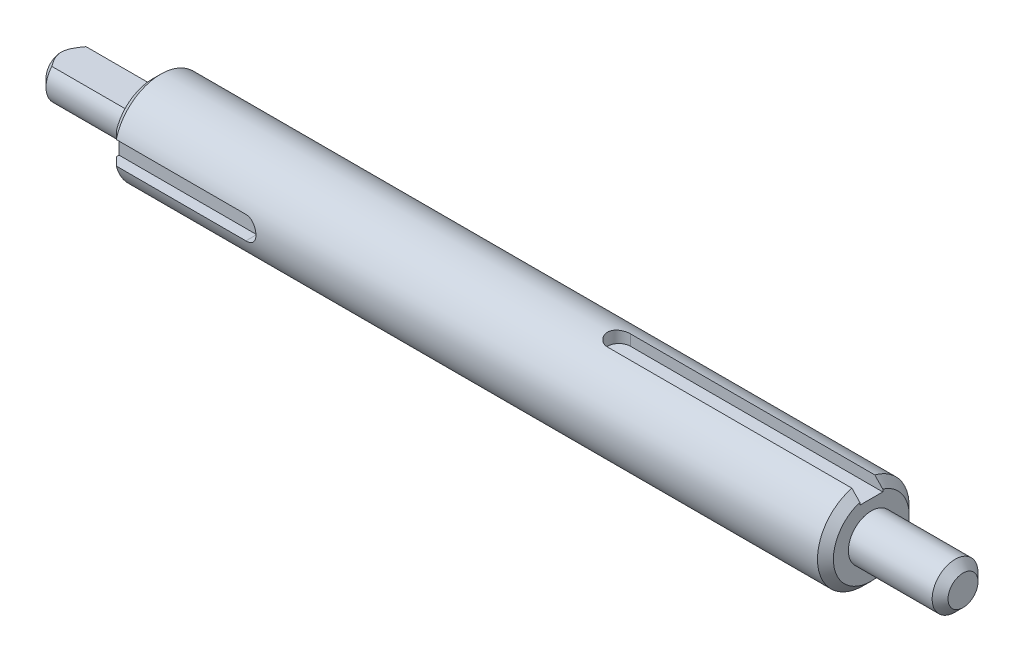
ISO-10303-21;
HEADER;
FILE_DESCRIPTION(('STEP AP214'),'2;1');
FILE_NAME('part.step','',(''),(''),'','','');
FILE_SCHEMA(('AUTOMOTIVE_DESIGN { 1 0 10303 214 1 1 1 1 }'));
ENDSEC;
DATA;
#1=APPLICATION_CONTEXT('core data for automotive mechanical design processes');
#2=APPLICATION_PROTOCOL_DEFINITION('international standard','automotive_design',2000,#1);
#3=PRODUCT_CONTEXT('',#1,'mechanical');
#4=PRODUCT('Part','Part','',(#3));
#5=PRODUCT_RELATED_PRODUCT_CATEGORY('part','',(#4));
#6=PRODUCT_DEFINITION_FORMATION('','',#4);
#7=PRODUCT_DEFINITION_CONTEXT('part definition',#1,'design');
#8=PRODUCT_DEFINITION('design','',#6,#7);
#9=PRODUCT_DEFINITION_SHAPE('','',#8);
#10=(LENGTH_UNIT() NAMED_UNIT(*) SI_UNIT(.MILLI.,.METRE.));
#11=(NAMED_UNIT(*) PLANE_ANGLE_UNIT() SI_UNIT($,.RADIAN.));
#12=(NAMED_UNIT(*) SI_UNIT($,.STERADIAN.) SOLID_ANGLE_UNIT());
#13=UNCERTAINTY_MEASURE_WITH_UNIT(LENGTH_MEASURE(1.E-05),#10,'distance_accuracy_value','');
#14=(GEOMETRIC_REPRESENTATION_CONTEXT(3) GLOBAL_UNCERTAINTY_ASSIGNED_CONTEXT((#13)) GLOBAL_UNIT_ASSIGNED_CONTEXT((#10,
#11,#12)) REPRESENTATION_CONTEXT('',''));
#15=CARTESIAN_POINT('',(0.,0.,0.));
#16=DIRECTION('',(0.,0.,1.));
#17=DIRECTION('',(1.,0.,0.));
#18=AXIS2_PLACEMENT_3D('',#15,#16,#17);
#19=CARTESIAN_POINT('',(0.,0.,0.));
#20=DIRECTION('',(-1.,0.,0.));
#21=DIRECTION('',(0.,0.,1.));
#22=AXIS2_PLACEMENT_3D('',#19,#20,#21);
#23=CYLINDRICAL_SURFACE('',#22,9.525);
#24=DIRECTION('',(-1.,0.,0.));
#25=VECTOR('',#24,1.);
#26=CARTESIAN_POINT('',(0.,2.38125,9.22254159315641));
#27=LINE('',#26,#25);
#28=CARTESIAN_POINT('',(28.575,2.38125,9.22254159315641));
#29=VERTEX_POINT('',#28);
#30=CARTESIAN_POINT('',(1.651,2.38125,9.22254159315641));
#31=VERTEX_POINT('',#30);
#32=EDGE_CURVE('E212',#29,#31,#27,.T.);
#33=ORIENTED_EDGE('',*,*,#32,.F.);
#34=CARTESIAN_POINT('',(28.575,-2.38125,9.22254159315641));
#35=CARTESIAN_POINT('',(28.640853740355,-2.38125762891168,9.22253423562082));
#36=CARTESIAN_POINT('',(28.7067029556357,-2.37851832615,9.2232467733226));
#37=CARTESIAN_POINT('',(28.8379089781664,-2.36760511039788,9.2260570707971));
#38=CARTESIAN_POINT('',(28.9032658664031,-2.35943211189246,9.22815459747728));
#39=CARTESIAN_POINT('',(29.0328981806898,-2.33773217686751,9.23367488041781));
#40=CARTESIAN_POINT('',(29.0971754881547,-2.32421584926354,9.23709501042331));
#41=CARTESIAN_POINT('',(29.2243085918205,-2.29195478238902,9.24515238273494));
#42=CARTESIAN_POINT('',(29.28716436846,-2.27320997121717,9.24978964177879));
#43=CARTESIAN_POINT('',(29.4729313522435,-2.20933850925812,9.26533297386109));
#44=CARTESIAN_POINT('',(29.5931724459728,-2.15655282913113,9.27787655688819));
#45=CARTESIAN_POINT('',(29.8230663455772,-2.03219018131673,9.30590486612671));
#46=CARTESIAN_POINT('',(29.9327163013928,-1.96060817472903,9.32139038069993));
#47=CARTESIAN_POINT('',(30.1407692118411,-1.79899882880256,9.35393711697461));
#48=CARTESIAN_POINT('',(30.2389081541545,-1.70863600473308,9.37102336365462));
#49=CARTESIAN_POINT('',(30.4188087696048,-1.5127500688518,9.40463033366142));
#50=CARTESIAN_POINT('',(30.500567824896,-1.40722453834541,9.42115096624208));
#51=CARTESIAN_POINT('',(30.6464750479129,-1.18218809655591,9.45204283098821));
#52=CARTESIAN_POINT('',(30.7103617368304,-1.06250268224561,9.46638087765492));
#53=CARTESIAN_POINT('',(30.8170059137597,-0.813679266376079,9.49100399767042));
#54=CARTESIAN_POINT('',(30.8597675601388,-0.684543130898577,9.50128986859056));
#55=CARTESIAN_POINT('',(30.9221004400311,-0.423253165723821,9.51647274320172));
#56=CARTESIAN_POINT('',(30.9421236351792,-0.2912133562233,9.52147462828273));
#57=CARTESIAN_POINT('',(30.9598299132639,-0.025557420138249,9.52589149614576));
#58=CARTESIAN_POINT('',(30.9575158041129,0.108058506211416,9.52530718114151));
#59=CARTESIAN_POINT('',(30.9309373964392,0.369933123383242,9.51869533972503));
#60=CARTESIAN_POINT('',(30.9071614435431,0.498244895882252,9.51278891849209));
#61=CARTESIAN_POINT('',(30.8391194583755,0.748995305905367,9.49633762329411));
#62=CARTESIAN_POINT('',(30.7948525195226,0.871433683308658,9.48579254410222));
#63=CARTESIAN_POINT('',(30.6866894502185,1.10825109980906,9.46106338419912));
#64=CARTESIAN_POINT('',(30.6226192674336,1.22254715548046,9.44684722801656));
#65=CARTESIAN_POINT('',(30.4768016721335,1.43893372812636,9.41631845321905));
#66=CARTESIAN_POINT('',(30.3950515964728,1.54102240268539,9.40000551891399));
#67=CARTESIAN_POINT('',(30.2135883405927,1.73300085924058,9.36654129091466));
#68=CARTESIAN_POINT('',(30.1134502904863,1.82248755164686,9.34937925198253));
#69=CARTESIAN_POINT('',(29.8993801293816,1.983508800913,9.31654938228026));
#70=CARTESIAN_POINT('',(29.785444254993,2.05503844352139,9.30088196126339));
#71=CARTESIAN_POINT('',(29.5462032951827,2.17837871398685,9.27277356095942));
#72=CARTESIAN_POINT('',(29.4208403242217,2.23008114884347,9.26035039909959));
#73=CARTESIAN_POINT('',(29.1628903141985,2.31148497534299,9.24037058808561));
#74=CARTESIAN_POINT('',(29.030314394903,2.3412192568134,9.23280666609916));
#75=CARTESIAN_POINT('',(28.842992112073,2.36673541245283,9.22627910899422));
#76=CARTESIAN_POINT('',(28.7895037067398,2.37217932098802,9.22487970561097));
#77=CARTESIAN_POINT('',(28.6823520128031,2.37943252926453,9.22301136162714));
#78=CARTESIAN_POINT('',(28.6286891485285,2.38124770946399,9.22254091563968));
#79=CARTESIAN_POINT('',(28.575,2.38125,9.22254159315641));
#80=B_SPLINE_CURVE_WITH_KNOTS('',3,(#34,#35,#36,#37,#38,#39,#40,#41,#42,#43,#44,#45,#46,#47,#48,
#49,#50,#51,#52,#53,#54,#55,#56,#57,#58,#59,#60,#61,#62,#63,#64,#65,#66,#67,#68,#69,#70,#71,#72,
#73,#74,#75,#76,#77,#78,#79),.UNSPECIFIED.,.F.,.F.,(4,2,2,2,2,2,2,2,2,2,2,2,2,2,2,2,2,2,2,2,2,2,
4),(0.,0.197492612871575,0.394951996364078,0.592021287293512,0.789093288422678,1.18284564181806,
1.57670365990575,1.97831795708804,2.37999638945288,2.78727614411439,3.19447569565353,
3.59343152992134,3.99233721407389,4.38238880306292,4.77245765073107,5.16605732012476,
5.55971631930075,5.96398847962896,6.36837115558446,6.77493008767309,7.18087909588358,
7.34212308655585,7.50310556421843),.UNSPECIFIED.);
#81=CARTESIAN_POINT('',(28.575,-2.38125,9.22254159315641));
#82=VERTEX_POINT('',#81);
#83=EDGE_CURVE('E298',#82,#29,#80,.T.);
#84=ORIENTED_EDGE('',*,*,#83,.F.);
#85=DIRECTION('',(-1.,0.,0.));
#86=VECTOR('',#85,1.);
#87=CARTESIAN_POINT('',(0.,-2.38125,9.22254159315641));
#88=LINE('',#87,#86);
#89=CARTESIAN_POINT('',(1.65100000000001,-2.38125,9.22254159315641));
#90=VERTEX_POINT('',#89);
#91=EDGE_CURVE('E210',#90,#82,#88,.F.);
#92=ORIENTED_EDGE('',*,*,#91,.F.);
#93=CARTESIAN_POINT('',(1.65100000000001,0.,0.));
#94=DIRECTION('',(1.,0.,0.));
#95=DIRECTION('',(0.,0.,-1.));
#96=AXIS2_PLACEMENT_3D('',#93,#94,#95);
#97=CIRCLE('',#96,9.525);
#98=EDGE_CURVE('E233',#90,#31,#97,.T.);
#99=ORIENTED_EDGE('',*,*,#98,.T.);
#100=EDGE_LOOP('',(#33,#84,#92,#99));
#101=FACE_BOUND('',#100,.T.);
#102=DIRECTION('',(-1.,0.,0.));
#103=VECTOR('',#102,1.);
#104=CARTESIAN_POINT('',(0.,9.22254159315642,-2.38124999999998));
#105=LINE('',#104,#103);
#106=CARTESIAN_POINT('',(147.574,9.22254159315641,-2.38125));
#107=VERTEX_POINT('',#106);
#108=CARTESIAN_POINT('',(96.8248,9.22254159315641,-2.38124999999999));
#109=VERTEX_POINT('',#108);
#110=EDGE_CURVE('E165',#107,#109,#105,.T.);
#111=ORIENTED_EDGE('',*,*,#110,.F.);
#112=CARTESIAN_POINT('',(147.574,0.,0.));
#113=DIRECTION('',(-1.,0.,0.));
#114=DIRECTION('',(0.,0.,1.));
#115=AXIS2_PLACEMENT_3D('',#112,#113,#114);
#116=CIRCLE('',#115,9.525);
#117=CARTESIAN_POINT('',(147.574,9.22254159315641,2.38125));
#118=VERTEX_POINT('',#117);
#119=EDGE_CURVE('E236',#107,#118,#116,.T.);
#120=ORIENTED_EDGE('',*,*,#119,.T.);
#121=DIRECTION('',(-1.,0.,0.));
#122=VECTOR('',#121,1.);
#123=CARTESIAN_POINT('',(0.,9.22254159315642,2.38124999999998));
#124=LINE('',#123,#122);
#125=CARTESIAN_POINT('',(96.8248,9.22254159315642,2.38124999999999));
#126=VERTEX_POINT('',#125);
#127=EDGE_CURVE('E80',#126,#118,#124,.F.);
#128=ORIENTED_EDGE('',*,*,#127,.F.);
#129=CARTESIAN_POINT('',(96.8248,9.22254159315641,-2.38124999999999));
#130=CARTESIAN_POINT('',(96.758946259645,9.22253423562082,-2.38125762891168));
#131=CARTESIAN_POINT('',(96.6930970443643,9.2232467733226,-2.37851832615));
#132=CARTESIAN_POINT('',(96.5618910218336,9.2260570707971,-2.36760511039787));
#133=CARTESIAN_POINT('',(96.4965341335969,9.22815459747728,-2.35943211189246));
#134=CARTESIAN_POINT('',(96.3669018193102,9.23367488041782,-2.33773217686751));
#135=CARTESIAN_POINT('',(96.3026245118453,9.23709501042331,-2.32421584926354));
#136=CARTESIAN_POINT('',(96.1754914081794,9.24515238273494,-2.29195478238901));
#137=CARTESIAN_POINT('',(96.11263563154,9.24978964177879,-2.27320997121716));
#138=CARTESIAN_POINT('',(95.9268686477565,9.26533297386109,-2.20933850925811));
#139=CARTESIAN_POINT('',(95.8066275540272,9.27787655688819,-2.15655282913112));
#140=CARTESIAN_POINT('',(95.5767336544228,9.30590486612672,-2.03219018131673));
#141=CARTESIAN_POINT('',(95.4670836986073,9.32139038069993,-1.96060817472902));
#142=CARTESIAN_POINT('',(95.2590307881589,9.35393711697461,-1.79899882880255));
#143=CARTESIAN_POINT('',(95.1608918458455,9.37102336365462,-1.70863600473308));
#144=CARTESIAN_POINT('',(94.9809912303952,9.40463033366142,-1.51275006885181));
#145=CARTESIAN_POINT('',(94.899232175104,9.42115096624208,-1.40722453834541));
#146=CARTESIAN_POINT('',(94.7533249520871,9.45204283098821,-1.18218809655591));
#147=CARTESIAN_POINT('',(94.6894382631696,9.46638087765492,-1.06250268224562));
#148=CARTESIAN_POINT('',(94.5827940862403,9.49100399767042,-0.813679266376076));
#149=CARTESIAN_POINT('',(94.5400324398612,9.50128986859056,-0.684543130898573));
#150=CARTESIAN_POINT('',(94.4776995599689,9.51647274320172,-0.423253165723816));
#151=CARTESIAN_POINT('',(94.4576763648208,9.52147462828273,-0.291213356223297));
#152=CARTESIAN_POINT('',(94.4399700867361,9.52589149614576,-0.0255574201382484));
#153=CARTESIAN_POINT('',(94.4422841958871,9.52530718114151,0.108058506211415));
#154=CARTESIAN_POINT('',(94.4688626035608,9.51869533972503,0.36993312338324));
#155=CARTESIAN_POINT('',(94.4926385564569,9.5127889184921,0.49824489588225));
#156=CARTESIAN_POINT('',(94.5606805416245,9.49633762329412,0.748995305905365));
#157=CARTESIAN_POINT('',(94.6049474804773,9.48579254410222,0.871433683308655));
#158=CARTESIAN_POINT('',(94.7131105497815,9.46106338419912,1.10825109980906));
#159=CARTESIAN_POINT('',(94.7771807325664,9.44684722801656,1.22254715548045));
#160=CARTESIAN_POINT('',(94.9229983278665,9.41631845321905,1.43893372812635));
#161=CARTESIAN_POINT('',(95.0047484035271,9.40000551891398,1.54102240268539));
#162=CARTESIAN_POINT('',(95.1862116594073,9.36654129091466,1.73300085924057));
#163=CARTESIAN_POINT('',(95.2863497095137,9.34937925198253,1.82248755164685));
#164=CARTESIAN_POINT('',(95.5004198706184,9.31654938228026,1.98350880091299));
#165=CARTESIAN_POINT('',(95.614355745007,9.30088196126339,2.05503844352139));
#166=CARTESIAN_POINT('',(95.8535967048173,9.27277356095942,2.17837871398684));
#167=CARTESIAN_POINT('',(95.9789596757783,9.26035039909959,2.23008114884346));
#168=CARTESIAN_POINT('',(96.2369096858015,9.24037058808561,2.31148497534298));
#169=CARTESIAN_POINT('',(96.369485605097,9.23280666609916,2.34121925681339));
#170=CARTESIAN_POINT('',(96.5568078879269,9.22627910899422,2.36673541245282));
#171=CARTESIAN_POINT('',(96.6102962932601,9.22487970561097,2.37217932098801));
#172=CARTESIAN_POINT('',(96.7174479871969,9.22301136162714,2.37943252926452));
#173=CARTESIAN_POINT('',(96.7711108514715,9.22254091563969,2.38124770946398));
#174=CARTESIAN_POINT('',(96.8248,9.22254159315641,2.38124999999999));
#175=B_SPLINE_CURVE_WITH_KNOTS('',3,(#129,#130,#131,#132,#133,#134,#135,#136,#137,#138,#139,
#140,#141,#142,#143,#144,#145,#146,#147,#148,#149,#150,#151,#152,#153,#154,#155,#156,#157,#158,
#159,#160,#161,#162,#163,#164,#165,#166,#167,#168,#169,#170,#171,#172,#173,#174),.UNSPECIFIED.,
.F.,.F.,(4,2,2,2,2,2,2,2,2,2,2,2,2,2,2,2,2,2,2,2,2,2,4),(0.,0.197492612871571,0.39495199636406,
0.592021287293512,0.789093288422675,1.18284564181805,1.57670365990573,1.97831795708802,
2.37999638945286,2.78727614411438,3.19447569565353,3.59343152992133,3.99233721407387,
4.38238880306291,4.77245765073105,5.16605732012474,5.55971631930073,5.96398847962894,
6.36837115558444,6.77493008767307,7.18087909588355,7.34212308655581,7.50310556421841),.UNSPECIFIED.);
#176=EDGE_CURVE('E13',#109,#126,#175,.T.);
#177=ORIENTED_EDGE('',*,*,#176,.F.);
#178=EDGE_LOOP('',(#111,#120,#128,#177));
#179=FACE_BOUND('',#178,.T.);
#180=ADVANCED_FACE('F57',(#101,#179),#23,.T.);
#181=CARTESIAN_POINT('',(149.225,9.525,0.));
#182=DIRECTION('',(-1.,0.,0.));
#183=DIRECTION('',(0.,0.,1.));
#184=AXIS2_PLACEMENT_3D('',#181,#182,#183);
#185=PLANE('',#184);
#186=CARTESIAN_POINT('',(149.225,0.,0.));
#187=DIRECTION('',(-1.,0.,0.));
#188=DIRECTION('',(0.,0.,1.));
#189=AXIS2_PLACEMENT_3D('',#186,#187,#188);
#190=CIRCLE('',#189,4.7625);
#191=CARTESIAN_POINT('',(149.225,0.,4.7625));
#192=VERTEX_POINT('',#191);
#193=EDGE_CURVE('E224',#192,#192,#190,.T.);
#194=ORIENTED_EDGE('',*,*,#193,.T.);
#195=EDGE_LOOP('',(#194));
#196=FACE_BOUND('',#195,.T.);
#197=DIRECTION('',(0.,-1.,0.));
#198=VECTOR('',#197,1.);
#199=CARTESIAN_POINT('',(149.225,26.035,-2.38125));
#200=LINE('',#199,#198);
#201=CARTESIAN_POINT('',(149.225,7.50529975667188,-2.38125));
#202=VERTEX_POINT('',#201);
#203=CARTESIAN_POINT('',(149.225,6.985,-2.38125));
#204=VERTEX_POINT('',#203);
#205=EDGE_CURVE('E185',#202,#204,#200,.T.);
#206=ORIENTED_EDGE('',*,*,#205,.T.);
#207=DIRECTION('',(0.,0.,-1.));
#208=VECTOR('',#207,1.);
#209=CARTESIAN_POINT('',(149.225,6.985,-2.38125));
#210=LINE('',#209,#208);
#211=CARTESIAN_POINT('',(149.225,6.985,2.38125));
#212=VERTEX_POINT('',#211);
#213=EDGE_CURVE('E180',#212,#204,#210,.T.);
#214=ORIENTED_EDGE('',*,*,#213,.F.);
#215=DIRECTION('',(0.,-1.,0.));
#216=VECTOR('',#215,1.);
#217=CARTESIAN_POINT('',(149.225,26.035,2.38125));
#218=LINE('',#217,#216);
#219=CARTESIAN_POINT('',(149.225,7.50529975667188,2.38125));
#220=VERTEX_POINT('',#219);
#221=EDGE_CURVE('E187',#220,#212,#218,.T.);
#222=ORIENTED_EDGE('',*,*,#221,.F.);
#223=CARTESIAN_POINT('',(149.225,0.,0.));
#224=DIRECTION('',(-1.,0.,0.));
#225=DIRECTION('',(0.,0.,1.));
#226=AXIS2_PLACEMENT_3D('',#223,#224,#225);
#227=CIRCLE('',#226,7.87399999999994);
#228=EDGE_CURVE('E239',#220,#202,#227,.F.);
#229=ORIENTED_EDGE('',*,*,#228,.T.);
#230=EDGE_LOOP('',(#206,#214,#222,#229));
#231=FACE_BOUND('',#230,.T.);
#232=ADVANCED_FACE('F286',(#196,#231),#185,.F.);
#233=CARTESIAN_POINT('',(147.574,0.,0.));
#234=DIRECTION('',(-1.,0.,0.));
#235=DIRECTION('',(0.,0.,1.));
#236=AXIS2_PLACEMENT_3D('',#233,#234,#235);
#237=CONICAL_SURFACE('',#236,9.525,0.785398163397446);
#238=ORIENTED_EDGE('',*,*,#119,.F.);
#239=CARTESIAN_POINT('',(144.544377447763,12.3267268918651,-2.38125));
#240=CARTESIAN_POINT('',(144.871011472609,11.9940342069174,-2.38125));
#241=CARTESIAN_POINT('',(145.197422472262,11.6611218695994,-2.38125));
#242=CARTESIAN_POINT('',(145.849618205934,10.9946833747652,-2.38125));
#243=CARTESIAN_POINT('',(146.175402938946,10.661157216263,-2.38125));
#244=CARTESIAN_POINT('',(146.826116957197,9.99336680512075,-2.38125));
#245=CARTESIAN_POINT('',(147.151046361344,9.65910266840477,-2.38125));
#246=CARTESIAN_POINT('',(147.799818385396,8.98951146801899,-2.38125));
#247=CARTESIAN_POINT('',(148.12366099004,8.65418438955094,-2.38125));
#248=CARTESIAN_POINT('',(148.769882414457,7.98200543317762,-2.38125));
#249=CARTESIAN_POINT('',(149.092260959666,7.64515329114877,-2.38125));
#250=CARTESIAN_POINT('',(149.734808226641,6.96936373377656,-2.38125));
#251=CARTESIAN_POINT('',(150.054977021991,6.63042638858683,-2.38125));
#252=CARTESIAN_POINT('',(150.53270205702,6.11959979624613,-2.38125));
#253=CARTESIAN_POINT('',(150.691535967678,5.94890600784378,-2.38125));
#254=CARTESIAN_POINT('',(151.008105629305,5.60650642622957,-2.38125));
#255=CARTESIAN_POINT('',(151.165841394782,5.43480064644199,-2.38125));
#256=CARTESIAN_POINT('',(151.479911999502,5.09007443079887,-2.38125));
#257=CARTESIAN_POINT('',(151.636246679001,4.91705384909032,-2.38125));
#258=CARTESIAN_POINT('',(151.869328329775,4.65624640411259,-2.38125));
#259=CARTESIAN_POINT('',(151.946787221201,4.56909584142591,-2.38125));
#260=CARTESIAN_POINT('',(152.101145836766,4.39429931206906,-2.38125));
#261=CARTESIAN_POINT('',(152.178045554517,4.30665333976002,-2.38125));
#262=CARTESIAN_POINT('',(152.254622552236,4.2187250792034,-2.38125));
#263=B_SPLINE_CURVE_WITH_KNOTS('',3,(#239,#240,#241,#242,#243,#244,#245,#246,#247,#248,#249,
#250,#251,#252,#253,#254,#255,#256,#257,#258,#259,#260,#261,#262),.UNSPECIFIED.,.F.,.F.,(4,2,2,
2,2,2,2,2,2,2,2,4),(0.,1.39870285440304,2.79740795755362,4.19590708804856,5.59442577469213,
6.99319671693377,8.39192085413371,9.09140360830165,9.79087710446925,10.4904293612113,
10.8402213132521,11.1900172547523),.UNSPECIFIED.);
#264=EDGE_CURVE('E73',#107,#202,#263,.T.);
#265=ORIENTED_EDGE('',*,*,#264,.T.);
#266=ORIENTED_EDGE('',*,*,#228,.F.);
#267=CARTESIAN_POINT('',(152.254622552237,4.21872507920312,2.38125));
#268=CARTESIAN_POINT('',(152.176903466784,4.30796448803654,2.38125));
#269=CARTESIAN_POINT('',(152.098852138418,4.39691325090974,2.38125));
#270=CARTESIAN_POINT('',(151.942174841149,4.57430153237104,2.38125));
#271=CARTESIAN_POINT('',(151.863548879032,4.66274105695214,2.38125));
#272=CARTESIAN_POINT('',(151.626948354664,4.92739881002045,2.38125));
#273=CARTESIAN_POINT('',(151.468243933894,5.10296447614969,2.38125));
#274=CARTESIAN_POINT('',(151.149403980207,5.45275189867959,2.38125));
#275=CARTESIAN_POINT('',(150.989268612496,5.62697380600144,2.38125));
#276=CARTESIAN_POINT('',(150.667879487852,5.97438646425941,2.38125));
#277=CARTESIAN_POINT('',(150.506625715773,6.14757720117076,2.38125));
#278=CARTESIAN_POINT('',(150.021622191152,6.66587408272564,2.38125));
#279=CARTESIAN_POINT('',(149.696574802156,7.00976533362352,2.38125));
#280=CARTESIAN_POINT('',(149.044245281741,7.69543798880757,2.38125));
#281=CARTESIAN_POINT('',(148.716963075393,8.03721932161403,2.38125));
#282=CARTESIAN_POINT('',(148.070559054687,8.70922333354125,2.38125));
#283=CARTESIAN_POINT('',(147.751481967278,9.03948906250626,2.38125));
#284=CARTESIAN_POINT('',(147.112287492113,9.69900245493944,2.38125));
#285=CARTESIAN_POINT('',(146.792170119146,10.0282501327521,2.38125));
#286=CARTESIAN_POINT('',(146.151112422429,10.6860349863018,2.38125));
#287=CARTESIAN_POINT('',(145.830171987329,11.0145720534685,2.38125));
#288=CARTESIAN_POINT('',(145.187685884089,11.6710529732297,2.38125));
#289=CARTESIAN_POINT('',(144.866140216879,11.9989968267339,2.38125));
#290=CARTESIAN_POINT('',(144.544377447763,12.3267268918651,2.38125));
#291=B_SPLINE_CURVE_WITH_KNOTS('',3,(#267,#268,#269,#270,#271,#272,#273,#274,#275,#276,#277,
#278,#279,#280,#281,#282,#283,#284,#285,#286,#287,#288,#289,#290),.UNSPECIFIED.,.F.,.F.,(4,2,2,
2,2,2,2,2,2,2,2,4),(0.,0.355012277588581,0.71002036861303,1.42000364350384,2.12990598185809,
2.83981795351643,4.2593958971253,5.67902167207614,7.05668698396228,8.43433279507376,
9.81217601304387,11.1900171163345),.UNSPECIFIED.);
#292=EDGE_CURVE('E305',#220,#118,#291,.T.);
#293=ORIENTED_EDGE('',*,*,#292,.T.);
#294=EDGE_LOOP('',(#238,#265,#266,#293));
#295=FACE_BOUND('',#294,.T.);
#296=ADVANCED_FACE('F288',(#295),#237,.T.);
#297=CARTESIAN_POINT('',(0.,0.,0.));
#298=DIRECTION('',(1.,0.,0.));
#299=DIRECTION('',(0.,0.,-1.));
#300=AXIS2_PLACEMENT_3D('',#297,#298,#299);
#301=PLANE('',#300);
#302=CARTESIAN_POINT('',(0.,0.,0.));
#303=DIRECTION('',(-1.,0.,0.));
#304=DIRECTION('',(0.,0.,1.));
#305=AXIS2_PLACEMENT_3D('',#302,#303,#304);
#306=CIRCLE('',#305,4.7625);
#307=CARTESIAN_POINT('',(0.,3.175,-3.54975791428092));
#308=VERTEX_POINT('',#307);
#309=CARTESIAN_POINT('',(0.,3.175,3.54975791428092));
#310=VERTEX_POINT('',#309);
#311=EDGE_CURVE('E214',#308,#310,#306,.T.);
#312=ORIENTED_EDGE('',*,*,#311,.F.);
#313=DIRECTION('',(0.,0.,-1.));
#314=VECTOR('',#313,1.);
#315=CARTESIAN_POINT('',(0.,3.175,-3.54975791428092));
#316=LINE('',#315,#314);
#317=EDGE_CURVE('E217',#310,#308,#316,.T.);
#318=ORIENTED_EDGE('',*,*,#317,.F.);
#319=EDGE_LOOP('',(#312,#318));
#320=FACE_BOUND('',#319,.T.);
#321=DIRECTION('',(0.,0.,-1.));
#322=VECTOR('',#321,1.);
#323=CARTESIAN_POINT('',(0.,2.38125,26.035));
#324=LINE('',#323,#322);
#325=CARTESIAN_POINT('',(0.,2.38125,7.50529975667194));
#326=VERTEX_POINT('',#325);
#327=CARTESIAN_POINT('',(0.,2.38125,6.985));
#328=VERTEX_POINT('',#327);
#329=EDGE_CURVE('E208',#326,#328,#324,.T.);
#330=ORIENTED_EDGE('',*,*,#329,.F.);
#331=CARTESIAN_POINT('',(0.,0.,0.));
#332=DIRECTION('',(1.,0.,0.));
#333=DIRECTION('',(0.,0.,-1.));
#334=AXIS2_PLACEMENT_3D('',#331,#332,#333);
#335=CIRCLE('',#334,7.87399999999999);
#336=CARTESIAN_POINT('',(0.,-2.38125,7.50529975667194));
#337=VERTEX_POINT('',#336);
#338=EDGE_CURVE('E242',#326,#337,#335,.F.);
#339=ORIENTED_EDGE('',*,*,#338,.T.);
#340=DIRECTION('',(0.,0.,-1.));
#341=VECTOR('',#340,1.);
#342=CARTESIAN_POINT('',(0.,-2.38125,26.035));
#343=LINE('',#342,#341);
#344=CARTESIAN_POINT('',(0.,-2.38125,6.985));
#345=VERTEX_POINT('',#344);
#346=EDGE_CURVE('E88',#337,#345,#343,.T.);
#347=ORIENTED_EDGE('',*,*,#346,.T.);
#348=DIRECTION('',(0.,-1.,0.));
#349=VECTOR('',#348,1.);
#350=CARTESIAN_POINT('',(0.,2.38125,6.985));
#351=LINE('',#350,#349);
#352=EDGE_CURVE('E195',#328,#345,#351,.T.);
#353=ORIENTED_EDGE('',*,*,#352,.F.);
#354=EDGE_LOOP('',(#330,#339,#347,#353));
#355=FACE_BOUND('',#354,.T.);
#356=ADVANCED_FACE('F294',(#320,#355),#301,.F.);
#357=CARTESIAN_POINT('',(0.,0.,0.));
#358=DIRECTION('',(1.,0.,0.));
#359=DIRECTION('',(0.,0.,-1.));
#360=AXIS2_PLACEMENT_3D('',#357,#358,#359);
#361=CONICAL_SURFACE('',#360,7.87399999999999,0.785398163397449);
#362=ORIENTED_EDGE('',*,*,#338,.F.);
#363=CARTESIAN_POINT('',(-3.02962255223665,2.38125,4.2187250792032));
#364=CARTESIAN_POINT('',(-2.95190346678364,2.38125,4.30796448803662));
#365=CARTESIAN_POINT('',(-2.8738521384184,2.38125,4.39691325090982));
#366=CARTESIAN_POINT('',(-2.71717484114867,2.38125,4.57430153237113));
#367=CARTESIAN_POINT('',(-2.63854887903162,2.38125,4.66274105695223));
#368=CARTESIAN_POINT('',(-2.40194835466418,2.38125,4.92739881002054));
#369=CARTESIAN_POINT('',(-2.24324393389403,2.38125,5.10296447614979));
#370=CARTESIAN_POINT('',(-1.92440398020672,2.38125,5.45275189867968));
#371=CARTESIAN_POINT('',(-1.76426861249565,2.38125,5.62697380600154));
#372=CARTESIAN_POINT('',(-1.44287948785221,2.38125,5.97438646425951));
#373=CARTESIAN_POINT('',(-1.2816257157729,2.38125,6.14757720117086));
#374=CARTESIAN_POINT('',(-0.7966221911522,2.38125,6.66587408272574));
#375=CARTESIAN_POINT('',(-0.471574802155931,2.38125,7.00976533362364));
#376=CARTESIAN_POINT('',(0.180754718259455,2.38125,7.69543798880771));
#377=CARTESIAN_POINT('',(0.508036924607092,2.38125,8.03721932161417));
#378=CARTESIAN_POINT('',(1.15444094531345,2.38125,8.70922333354137));
#379=CARTESIAN_POINT('',(1.47351803272249,2.38125,9.03948906250637));
#380=CARTESIAN_POINT('',(2.11271250788722,2.38125,9.69900245493951));
#381=CARTESIAN_POINT('',(2.43282988085358,2.38125,10.0282501327521));
#382=CARTESIAN_POINT('',(3.0738875775706,2.38125,10.6860349863018));
#383=CARTESIAN_POINT('',(3.39482801267135,2.38125,11.0145720534685));
#384=CARTESIAN_POINT('',(4.03731411591137,2.38125,11.6710529732297));
#385=CARTESIAN_POINT('',(4.35885978312099,2.38125,11.9989968267339));
#386=CARTESIAN_POINT('',(4.68062255223665,2.38125,12.3267268918651));
#387=B_SPLINE_CURVE_WITH_KNOTS('',3,(#363,#364,#365,#366,#367,#368,#369,#370,#371,#372,#373,
#374,#375,#376,#377,#378,#379,#380,#381,#382,#383,#384,#385,#386),.UNSPECIFIED.,.F.,.F.,(4,2,2,
2,2,2,2,2,2,2,2,4),(0.,0.355012277588593,0.710020368613024,1.42000364350386,2.12990598185811,
2.83981795351646,4.25939589712536,5.67902167207621,7.05668698396226,8.4343327950737,
9.81217601304376,11.1900171163343),.UNSPECIFIED.);
#388=EDGE_CURVE('E306',#326,#31,#387,.T.);
#389=ORIENTED_EDGE('',*,*,#388,.T.);
#390=ORIENTED_EDGE('',*,*,#98,.F.);
#391=CARTESIAN_POINT('',(4.68062255223665,-2.38125,12.3267268918651));
#392=CARTESIAN_POINT('',(4.35398852739068,-2.38125,11.9940342069174));
#393=CARTESIAN_POINT('',(4.02757752773812,-2.38125,11.6611218695994));
#394=CARTESIAN_POINT('',(3.37538179406591,-2.38125,10.9946833747652));
#395=CARTESIAN_POINT('',(3.04959706105396,-2.38125,10.661157216263));
#396=CARTESIAN_POINT('',(2.39888304280326,-2.38125,9.99336680512076));
#397=CARTESIAN_POINT('',(2.07395363865643,-2.38125,9.65910266840477));
#398=CARTESIAN_POINT('',(1.42518161460429,-2.38125,8.989511468019));
#399=CARTESIAN_POINT('',(1.10133900995975,-2.38125,8.65418438955097));
#400=CARTESIAN_POINT('',(0.45511758554273,-2.38125,7.98200543317766));
#401=CARTESIAN_POINT('',(0.132739040334213,-2.38125,7.64515329114882));
#402=CARTESIAN_POINT('',(-0.509808226640962,-2.38125,6.96936373377661));
#403=CARTESIAN_POINT('',(-0.829977021990774,-2.38125,6.63042638858689));
#404=CARTESIAN_POINT('',(-1.30770205702032,-2.38125,6.11959979624619));
#405=CARTESIAN_POINT('',(-1.46653596767752,-2.38125,5.94890600784384));
#406=CARTESIAN_POINT('',(-1.78310562930509,-2.38125,5.60650642622963));
#407=CARTESIAN_POINT('',(-1.94084139478233,-2.38125,5.43480064644206));
#408=CARTESIAN_POINT('',(-2.2549119995024,-2.38125,5.09007443079894));
#409=CARTESIAN_POINT('',(-2.41124667900132,-2.38125,4.91705384909039));
#410=CARTESIAN_POINT('',(-2.64432832977488,-2.38125,4.65624640411266));
#411=CARTESIAN_POINT('',(-2.72178722120125,-2.38125,4.56909584142599));
#412=CARTESIAN_POINT('',(-2.8761458367662,-2.38125,4.39429931206914));
#413=CARTESIAN_POINT('',(-2.95304555451728,-2.38125,4.30665333976011));
#414=CARTESIAN_POINT('',(-3.0296225522364,-2.38125,4.21872507920349));
#415=B_SPLINE_CURVE_WITH_KNOTS('',3,(#391,#392,#393,#394,#395,#396,#397,#398,#399,#400,#401,
#402,#403,#404,#405,#406,#407,#408,#409,#410,#411,#412,#413,#414),.UNSPECIFIED.,.F.,.F.,(4,2,2,
2,2,2,2,2,2,2,2,4),(0.,1.39870285440304,2.79740795755358,4.1959070880485,5.59442577469203,
6.99319671693366,8.39192085413359,9.09140360830151,9.79087710446911,10.4904293612111,
10.8402213132519,11.1900172547521),.UNSPECIFIED.);
#416=EDGE_CURVE('E258',#90,#337,#415,.T.);
#417=ORIENTED_EDGE('',*,*,#416,.T.);
#418=EDGE_LOOP('',(#362,#389,#390,#417));
#419=FACE_BOUND('',#418,.T.);
#420=ADVANCED_FACE('F284',(#419),#361,.T.);
#421=CARTESIAN_POINT('',(0.,0.,0.));
#422=DIRECTION('',(-1.,0.,0.));
#423=DIRECTION('',(0.,0.,1.));
#424=AXIS2_PLACEMENT_3D('',#421,#422,#423);
#425=CYLINDRICAL_SURFACE('',#424,4.7625);
#426=CARTESIAN_POINT('',(166.624,0.,0.));
#427=DIRECTION('',(-1.,0.,0.));
#428=DIRECTION('',(0.,0.,1.));
#429=AXIS2_PLACEMENT_3D('',#426,#427,#428);
#430=CIRCLE('',#429,4.7625);
#431=CARTESIAN_POINT('',(166.624,0.,4.7625));
#432=VERTEX_POINT('',#431);
#433=EDGE_CURVE('E227',#432,#432,#430,.T.);
#434=ORIENTED_EDGE('',*,*,#433,.T.);
#435=EDGE_LOOP('',(#434));
#436=FACE_BOUND('',#435,.T.);
#437=ORIENTED_EDGE('',*,*,#193,.F.);
#438=EDGE_LOOP('',(#437));
#439=FACE_BOUND('',#438,.T.);
#440=ADVANCED_FACE('F280',(#436,#439),#425,.T.);
#441=CARTESIAN_POINT('',(168.275,4.7625,0.));
#442=DIRECTION('',(-1.,0.,0.));
#443=DIRECTION('',(0.,0.,1.));
#444=AXIS2_PLACEMENT_3D('',#441,#442,#443);
#445=PLANE('',#444);
#446=CARTESIAN_POINT('',(168.275,0.,0.));
#447=DIRECTION('',(-1.,0.,0.));
#448=DIRECTION('',(0.,0.,1.));
#449=AXIS2_PLACEMENT_3D('',#446,#447,#448);
#450=CIRCLE('',#449,3.11149999999996);
#451=CARTESIAN_POINT('',(168.275,0.,3.11149999999996));
#452=VERTEX_POINT('',#451);
#453=EDGE_CURVE('E230',#452,#452,#450,.F.);
#454=ORIENTED_EDGE('',*,*,#453,.T.);
#455=EDGE_LOOP('',(#454));
#456=FACE_BOUND('',#455,.T.);
#457=ADVANCED_FACE('F276',(#456),#445,.F.);
#458=CARTESIAN_POINT('',(-19.05,0.,0.));
#459=DIRECTION('',(1.,0.,0.));
#460=DIRECTION('',(0.,0.,-1.));
#461=AXIS2_PLACEMENT_3D('',#458,#459,#460);
#462=CYLINDRICAL_SURFACE('',#461,4.7625);
#463=DIRECTION('',(1.,0.,0.));
#464=VECTOR('',#463,1.);
#465=CARTESIAN_POINT('',(-19.05,3.175,3.54975791428092));
#466=LINE('',#465,#464);
#467=CARTESIAN_POINT('',(-17.3990000000001,3.175,3.54975791428092));
#468=VERTEX_POINT('',#467);
#469=EDGE_CURVE('E222',#468,#310,#466,.T.);
#470=ORIENTED_EDGE('',*,*,#469,.F.);
#471=CARTESIAN_POINT('',(-17.3990000000001,0.,0.));
#472=DIRECTION('',(-1.,0.,0.));
#473=DIRECTION('',(0.,0.,1.));
#474=AXIS2_PLACEMENT_3D('',#471,#472,#473);
#475=CIRCLE('',#474,4.7625);
#476=CARTESIAN_POINT('',(-17.3990000000001,3.175,-3.54975791428092));
#477=VERTEX_POINT('',#476);
#478=EDGE_CURVE('E248',#468,#477,#475,.F.);
#479=ORIENTED_EDGE('',*,*,#478,.T.);
#480=DIRECTION('',(1.,0.,0.));
#481=VECTOR('',#480,1.);
#482=CARTESIAN_POINT('',(-19.05,3.175,-3.54975791428092));
#483=LINE('',#482,#481);
#484=EDGE_CURVE('E220',#477,#308,#483,.T.);
#485=ORIENTED_EDGE('',*,*,#484,.T.);
#486=ORIENTED_EDGE('',*,*,#311,.T.);
#487=EDGE_LOOP('',(#470,#479,#485,#486));
#488=FACE_BOUND('',#487,.T.);
#489=ADVANCED_FACE('F271',(#488),#462,.T.);
#490=CARTESIAN_POINT('',(-19.05,3.175,-3.54975791428092));
#491=DIRECTION('',(0.,-1.,0.));
#492=DIRECTION('',(0.,0.,-1.));
#493=AXIS2_PLACEMENT_3D('',#490,#491,#492);
#494=PLANE('',#493);
#495=ORIENTED_EDGE('',*,*,#484,.F.);
#496=CARTESIAN_POINT('',(-17.3990000000001,3.175,-3.54975791428092));
#497=CARTESIAN_POINT('',(-17.4669470389347,3.175,-3.45857305475788));
#498=CARTESIAN_POINT('',(-17.5341732310121,3.175,-3.36684084483271));
#499=CARTESIAN_POINT('',(-17.6668452459381,3.175,-3.18205577571565));
#500=CARTESIAN_POINT('',(-17.7322905025307,3.175,-3.08900251047409));
#501=CARTESIAN_POINT('',(-17.8616553867615,3.175,-2.90047876396715));
#502=CARTESIAN_POINT('',(-17.925553523648,3.175,-2.80499347797771));
#503=CARTESIAN_POINT('',(-18.0506372930985,3.175,-2.61226814970557));
#504=CARTESIAN_POINT('',(-18.1118231581287,3.175,-2.5150282588175));
#505=CARTESIAN_POINT('',(-18.2340426775852,3.175,-2.31324134884466));
#506=CARTESIAN_POINT('',(-18.2948921820951,3.175,-2.20858213015586));
#507=CARTESIAN_POINT('',(-18.4119165864291,3.175,-1.99663711214734));
#508=CARTESIAN_POINT('',(-18.4680905943773,3.175,-1.88935081672712));
#509=CARTESIAN_POINT('',(-18.5742752540992,3.175,-1.67226872969871));
#510=CARTESIAN_POINT('',(-18.6243093970026,3.175,-1.56248453764203));
#511=CARTESIAN_POINT('',(-18.7168719572219,3.175,-1.33980621456212));
#512=CARTESIAN_POINT('',(-18.7594034358172,3.175,-1.22691337378611));
#513=CARTESIAN_POINT('',(-18.832855587278,3.175,-1.00477128109041));
#514=CARTESIAN_POINT('',(-18.8643149536052,3.175,-0.895702556711073));
#515=CARTESIAN_POINT('',(-18.9172783828297,3.175,-0.675125615848535));
#516=CARTESIAN_POINT('',(-18.9387822406612,3.175,-0.563617349164628));
#517=CARTESIAN_POINT('',(-18.9700860928879,3.175,-0.341142376880239));
#518=CARTESIAN_POINT('',(-18.9801047802836,3.175,-0.230207038732285));
#519=CARTESIAN_POINT('',(-18.9884328516423,3.175,-0.00789375522870676));
#520=CARTESIAN_POINT('',(-18.9867429412297,3.175,0.103484163050306));
#521=CARTESIAN_POINT('',(-18.9718043059589,3.175,0.325186884520133));
#522=CARTESIAN_POINT('',(-18.958582176543,3.175,0.435513520743943));
#523=CARTESIAN_POINT('',(-18.921562593505,3.175,0.654387176573956));
#524=CARTESIAN_POINT('',(-18.8977608536432,3.175,0.762933456383382));
#525=CARTESIAN_POINT('',(-18.8404102716599,3.175,0.979902435336482));
#526=CARTESIAN_POINT('',(-18.8066611441354,3.175,1.08827134980428));
#527=CARTESIAN_POINT('',(-18.7313000214071,3.175,1.30217881920123));
#528=CARTESIAN_POINT('',(-18.6896891301885,3.175,1.40771776915377));
#529=CARTESIAN_POINT('',(-18.5827122102621,3.175,1.65655963991156));
#530=CARTESIAN_POINT('',(-18.5144009244719,3.175,1.79858820071933));
#531=CARTESIAN_POINT('',(-18.368808559474,3.175,2.07800604375395));
#532=CARTESIAN_POINT('',(-18.2915212887709,3.175,2.21539203826424));
#533=CARTESIAN_POINT('',(-18.1300420399602,3.175,2.48675657627162));
#534=CARTESIAN_POINT('',(-18.0458236460603,3.175,2.62071926772581));
#535=CARTESIAN_POINT('',(-17.8724614975705,3.175,2.88534391958498));
#536=CARTESIAN_POINT('',(-17.7833190446655,3.175,3.01600673913451));
#537=CARTESIAN_POINT('',(-17.6086834617304,3.175,3.26414246678804));
#538=CARTESIAN_POINT('',(-17.5234840472616,3.175,3.38182318067155));
#539=CARTESIAN_POINT('',(-17.3505666617404,3.175,3.61532929054212));
#540=CARTESIAN_POINT('',(-17.2628484853188,3.175,3.73115453403566));
#541=CARTESIAN_POINT('',(-17.0862371812907,3.175,3.96016962894618));
#542=CARTESIAN_POINT('',(-16.9973628466826,3.175,4.07337401835378));
#543=CARTESIAN_POINT('',(-16.8180116236792,3.175,4.29846534428088));
#544=CARTESIAN_POINT('',(-16.7275351041621,3.175,4.41035257442875));
#545=CARTESIAN_POINT('',(-16.6364215363939,3.175,4.52171063083483));
#546=B_SPLINE_CURVE_WITH_KNOTS('',3,(#496,#497,#498,#499,#500,#501,#502,#503,#504,#505,#506,
#507,#508,#509,#510,#511,#512,#513,#514,#515,#516,#517,#518,#519,#520,#521,#522,#523,#524,#525,
#526,#527,#528,#529,#530,#531,#532,#533,#534,#535,#536,#537,#538,#539,#540,#541,#542,#543,#544,
#545),.UNSPECIFIED.,.F.,.F.,(4,2,2,2,2,2,2,2,2,2,2,2,2,2,2,2,2,2,2,2,2,2,2,2,4),(0.,
0.341158550334106,0.682424335263791,1.02706535296938,1.37167677447751,1.73476998827014,
2.09793230604618,2.45965871492984,2.82123718705436,3.1613886877699,3.50154719469229,
3.83511503688641,4.16866277662503,4.50144332110719,4.83435881187498,5.17449785380801,
5.51458916729856,5.98693216069139,6.45960292605278,6.93416689791882,7.40860601268986,
7.84442071265234,8.28027104855772,8.71202474949309,9.1436803059649),.UNSPECIFIED.);
#547=EDGE_CURVE('E251',#477,#468,#546,.T.);
#548=ORIENTED_EDGE('',*,*,#547,.T.);
#549=ORIENTED_EDGE('',*,*,#469,.T.);
#550=ORIENTED_EDGE('',*,*,#317,.T.);
#551=EDGE_LOOP('',(#495,#548,#549,#550));
#552=FACE_BOUND('',#551,.T.);
#553=ADVANCED_FACE('F265',(#552),#494,.F.);
#554=CARTESIAN_POINT('',(-19.05,0.,0.));
#555=DIRECTION('',(-1.,0.,0.));
#556=DIRECTION('',(0.,0.,1.));
#557=AXIS2_PLACEMENT_3D('',#554,#555,#556);
#558=PLANE('',#557);
#559=CARTESIAN_POINT('',(-19.05,0.,0.));
#560=DIRECTION('',(-1.,0.,0.));
#561=DIRECTION('',(0.,0.,1.));
#562=AXIS2_PLACEMENT_3D('',#559,#560,#561);
#563=CIRCLE('',#562,3.1115000000001);
#564=CARTESIAN_POINT('',(-19.05,2.0743333333334,-2.31917517066361));
#565=VERTEX_POINT('',#564);
#566=EDGE_CURVE('E245',#565,#565,#563,.T.);
#567=ORIENTED_EDGE('',*,*,#566,.T.);
#568=EDGE_LOOP('',(#567));
#569=FACE_BOUND('',#568,.T.);
#570=ADVANCED_FACE('F270',(#569),#558,.T.);
#571=CARTESIAN_POINT('',(166.624,0.,0.));
#572=DIRECTION('',(-1.,0.,0.));
#573=DIRECTION('',(0.,0.,1.));
#574=AXIS2_PLACEMENT_3D('',#571,#572,#573);
#575=CONICAL_SURFACE('',#574,4.7625,0.785398163397448);
#576=ORIENTED_EDGE('',*,*,#453,.F.);
#577=EDGE_LOOP('',(#576));
#578=FACE_BOUND('',#577,.T.);
#579=ORIENTED_EDGE('',*,*,#433,.F.);
#580=EDGE_LOOP('',(#579));
#581=FACE_BOUND('',#580,.T.);
#582=ADVANCED_FACE('F364',(#578,#581),#575,.T.);
#583=CARTESIAN_POINT('',(-19.05,0.,0.));
#584=DIRECTION('',(1.,0.,0.));
#585=DIRECTION('',(0.,0.,-1.));
#586=AXIS2_PLACEMENT_3D('',#583,#584,#585);
#587=CONICAL_SURFACE('',#586,3.1115000000001,0.785398163397451);
#588=ORIENTED_EDGE('',*,*,#547,.F.);
#589=ORIENTED_EDGE('',*,*,#478,.F.);
#590=EDGE_LOOP('',(#588,#589));
#591=FACE_BOUND('',#590,.T.);
#592=ORIENTED_EDGE('',*,*,#566,.F.);
#593=EDGE_LOOP('',(#592));
#594=FACE_BOUND('',#593,.T.);
#595=ADVANCED_FACE('F60',(#591,#594),#587,.T.);
#596=CARTESIAN_POINT('',(28.575,0.,26.035));
#597=DIRECTION('',(0.,0.,-1.));
#598=DIRECTION('',(-1.,0.,0.));
#599=AXIS2_PLACEMENT_3D('',#596,#597,#598);
#600=CYLINDRICAL_SURFACE('',#599,2.38125);
#601=ORIENTED_EDGE('',*,*,#83,.T.);
#602=DIRECTION('',(0.,0.,-1.));
#603=VECTOR('',#602,1.);
#604=CARTESIAN_POINT('',(28.575,2.38125,26.035));
#605=LINE('',#604,#603);
#606=CARTESIAN_POINT('',(28.575,2.38125,6.985));
#607=VERTEX_POINT('',#606);
#608=EDGE_CURVE('E203',#29,#607,#605,.T.);
#609=ORIENTED_EDGE('',*,*,#608,.T.);
#610=CARTESIAN_POINT('',(28.575,0.,6.985));
#611=DIRECTION('',(0.,0.,1.));
#612=DIRECTION('',(1.,0.,0.));
#613=AXIS2_PLACEMENT_3D('',#610,#611,#612);
#614=CIRCLE('',#613,2.38125);
#615=CARTESIAN_POINT('',(28.575,-2.38125,6.985));
#616=VERTEX_POINT('',#615);
#617=EDGE_CURVE('E200',#616,#607,#614,.T.);
#618=ORIENTED_EDGE('',*,*,#617,.F.);
#619=DIRECTION('',(0.,0.,-1.));
#620=VECTOR('',#619,1.);
#621=CARTESIAN_POINT('',(28.575,-2.38125,26.035));
#622=LINE('',#621,#620);
#623=EDGE_CURVE('E205',#82,#616,#622,.T.);
#624=ORIENTED_EDGE('',*,*,#623,.F.);
#625=EDGE_LOOP('',(#601,#609,#618,#624));
#626=FACE_BOUND('',#625,.T.);
#627=ADVANCED_FACE('F317',(#626),#600,.F.);
#628=CARTESIAN_POINT('',(0.,2.38125,26.035));
#629=DIRECTION('',(0.,-1.,0.));
#630=DIRECTION('',(0.,0.,-1.));
#631=AXIS2_PLACEMENT_3D('',#628,#629,#630);
#632=PLANE('',#631);
#633=ORIENTED_EDGE('',*,*,#32,.T.);
#634=ORIENTED_EDGE('',*,*,#388,.F.);
#635=ORIENTED_EDGE('',*,*,#329,.T.);
#636=DIRECTION('',(-1.,0.,0.));
#637=VECTOR('',#636,1.);
#638=CARTESIAN_POINT('',(0.,2.38125,6.985));
#639=LINE('',#638,#637);
#640=EDGE_CURVE('E192',#607,#328,#639,.T.);
#641=ORIENTED_EDGE('',*,*,#640,.F.);
#642=ORIENTED_EDGE('',*,*,#608,.F.);
#643=EDGE_LOOP('',(#633,#634,#635,#641,#642));
#644=FACE_BOUND('',#643,.T.);
#645=ADVANCED_FACE('F321',(#644),#632,.T.);
#646=CARTESIAN_POINT('',(0.,-2.38125,26.035));
#647=DIRECTION('',(0.,1.,0.));
#648=DIRECTION('',(-1.,0.,0.));
#649=AXIS2_PLACEMENT_3D('',#646,#647,#648);
#650=PLANE('',#649);
#651=ORIENTED_EDGE('',*,*,#91,.T.);
#652=ORIENTED_EDGE('',*,*,#623,.T.);
#653=DIRECTION('',(1.,0.,0.));
#654=VECTOR('',#653,1.);
#655=CARTESIAN_POINT('',(0.,-2.38125,6.985));
#656=LINE('',#655,#654);
#657=EDGE_CURVE('E197',#345,#616,#656,.T.);
#658=ORIENTED_EDGE('',*,*,#657,.F.);
#659=ORIENTED_EDGE('',*,*,#346,.F.);
#660=ORIENTED_EDGE('',*,*,#416,.F.);
#661=EDGE_LOOP('',(#651,#652,#658,#659,#660));
#662=FACE_BOUND('',#661,.T.);
#663=ADVANCED_FACE('F325',(#662),#650,.T.);
#664=CARTESIAN_POINT('',(28.575,0.,6.985));
#665=DIRECTION('',(0.,0.,1.));
#666=DIRECTION('',(1.,0.,0.));
#667=AXIS2_PLACEMENT_3D('',#664,#665,#666);
#668=PLANE('',#667);
#669=ORIENTED_EDGE('',*,*,#640,.T.);
#670=ORIENTED_EDGE('',*,*,#352,.T.);
#671=ORIENTED_EDGE('',*,*,#657,.T.);
#672=ORIENTED_EDGE('',*,*,#617,.T.);
#673=EDGE_LOOP('',(#669,#670,#671,#672));
#674=FACE_BOUND('',#673,.T.);
#675=ADVANCED_FACE('F323',(#674),#668,.T.);
#676=CARTESIAN_POINT('',(96.8248,26.035,0.));
#677=DIRECTION('',(0.,-1.,0.));
#678=DIRECTION('',(0.,0.,-1.));
#679=AXIS2_PLACEMENT_3D('',#676,#677,#678);
#680=CYLINDRICAL_SURFACE('',#679,2.38124999999999);
#681=ORIENTED_EDGE('',*,*,#176,.T.);
#682=DIRECTION('',(0.,-1.,0.));
#683=VECTOR('',#682,1.);
#684=CARTESIAN_POINT('',(96.8248,26.035,2.38124999999999));
#685=LINE('',#684,#683);
#686=CARTESIAN_POINT('',(96.8248,6.985,2.38124999999999));
#687=VERTEX_POINT('',#686);
#688=EDGE_CURVE('E168',#126,#687,#685,.T.);
#689=ORIENTED_EDGE('',*,*,#688,.T.);
#690=CARTESIAN_POINT('',(96.8248,6.985,0.));
#691=DIRECTION('',(0.,1.,0.));
#692=DIRECTION('',(0.,0.,1.));
#693=AXIS2_PLACEMENT_3D('',#690,#691,#692);
#694=CIRCLE('',#693,2.38124999999999);
#695=CARTESIAN_POINT('',(96.8248,6.985,-2.38124999999999));
#696=VERTEX_POINT('',#695);
#697=EDGE_CURVE('E171',#696,#687,#694,.T.);
#698=ORIENTED_EDGE('',*,*,#697,.F.);
#699=DIRECTION('',(0.,-1.,0.));
#700=VECTOR('',#699,1.);
#701=CARTESIAN_POINT('',(96.8248,26.035,-2.38124999999999));
#702=LINE('',#701,#700);
#703=EDGE_CURVE('E158',#109,#696,#702,.T.);
#704=ORIENTED_EDGE('',*,*,#703,.F.);
#705=EDGE_LOOP('',(#681,#689,#698,#704));
#706=FACE_BOUND('',#705,.T.);
#707=ADVANCED_FACE('F172',(#706),#680,.F.);
#708=CARTESIAN_POINT('',(149.225,26.035,-2.38125));
#709=DIRECTION('',(0.,0.,1.));
#710=DIRECTION('',(1.,0.,0.));
#711=AXIS2_PLACEMENT_3D('',#708,#709,#710);
#712=PLANE('',#711);
#713=ORIENTED_EDGE('',*,*,#110,.T.);
#714=ORIENTED_EDGE('',*,*,#703,.T.);
#715=DIRECTION('',(-1.,0.,0.));
#716=VECTOR('',#715,1.);
#717=CARTESIAN_POINT('',(149.225,6.985,-2.38125));
#718=LINE('',#717,#716);
#719=EDGE_CURVE('E162',#204,#696,#718,.T.);
#720=ORIENTED_EDGE('',*,*,#719,.F.);
#721=ORIENTED_EDGE('',*,*,#205,.F.);
#722=ORIENTED_EDGE('',*,*,#264,.F.);
#723=EDGE_LOOP('',(#713,#714,#720,#721,#722));
#724=FACE_BOUND('',#723,.T.);
#725=ADVANCED_FACE('F160',(#724),#712,.T.);
#726=CARTESIAN_POINT('',(149.225,26.035,2.38125));
#727=DIRECTION('',(0.,0.,-1.));
#728=DIRECTION('',(-1.,0.,0.));
#729=AXIS2_PLACEMENT_3D('',#726,#727,#728);
#730=PLANE('',#729);
#731=ORIENTED_EDGE('',*,*,#127,.T.);
#732=ORIENTED_EDGE('',*,*,#292,.F.);
#733=ORIENTED_EDGE('',*,*,#221,.T.);
#734=DIRECTION('',(1.,0.,0.));
#735=VECTOR('',#734,1.);
#736=CARTESIAN_POINT('',(149.225,6.985,2.38125));
#737=LINE('',#736,#735);
#738=EDGE_CURVE('E176',#687,#212,#737,.T.);
#739=ORIENTED_EDGE('',*,*,#738,.F.);
#740=ORIENTED_EDGE('',*,*,#688,.F.);
#741=EDGE_LOOP('',(#731,#732,#733,#739,#740));
#742=FACE_BOUND('',#741,.T.);
#743=ADVANCED_FACE('F392',(#742),#730,.T.);
#744=CARTESIAN_POINT('',(96.8248,6.985,0.));
#745=DIRECTION('',(0.,1.,0.));
#746=DIRECTION('',(0.,0.,1.));
#747=AXIS2_PLACEMENT_3D('',#744,#745,#746);
#748=PLANE('',#747);
#749=ORIENTED_EDGE('',*,*,#719,.T.);
#750=ORIENTED_EDGE('',*,*,#697,.T.);
#751=ORIENTED_EDGE('',*,*,#738,.T.);
#752=ORIENTED_EDGE('',*,*,#213,.T.);
#753=EDGE_LOOP('',(#749,#750,#751,#752));
#754=FACE_BOUND('',#753,.T.);
#755=ADVANCED_FACE('F178',(#754),#748,.T.);
#756=CLOSED_SHELL('',(#180,#232,#296,#356,#420,#440,#457,#489,#553,#570,#582,#595,#627,#645,
#663,#675,#707,#725,#743,#755));
#757=MANIFOLD_SOLID_BREP('B2',#756);
#758=ADVANCED_BREP_SHAPE_REPRESENTATION('',(#18,#757),#14);
#759=SHAPE_DEFINITION_REPRESENTATION(#9,#758);
ENDSEC;
END-ISO-10303-21;
